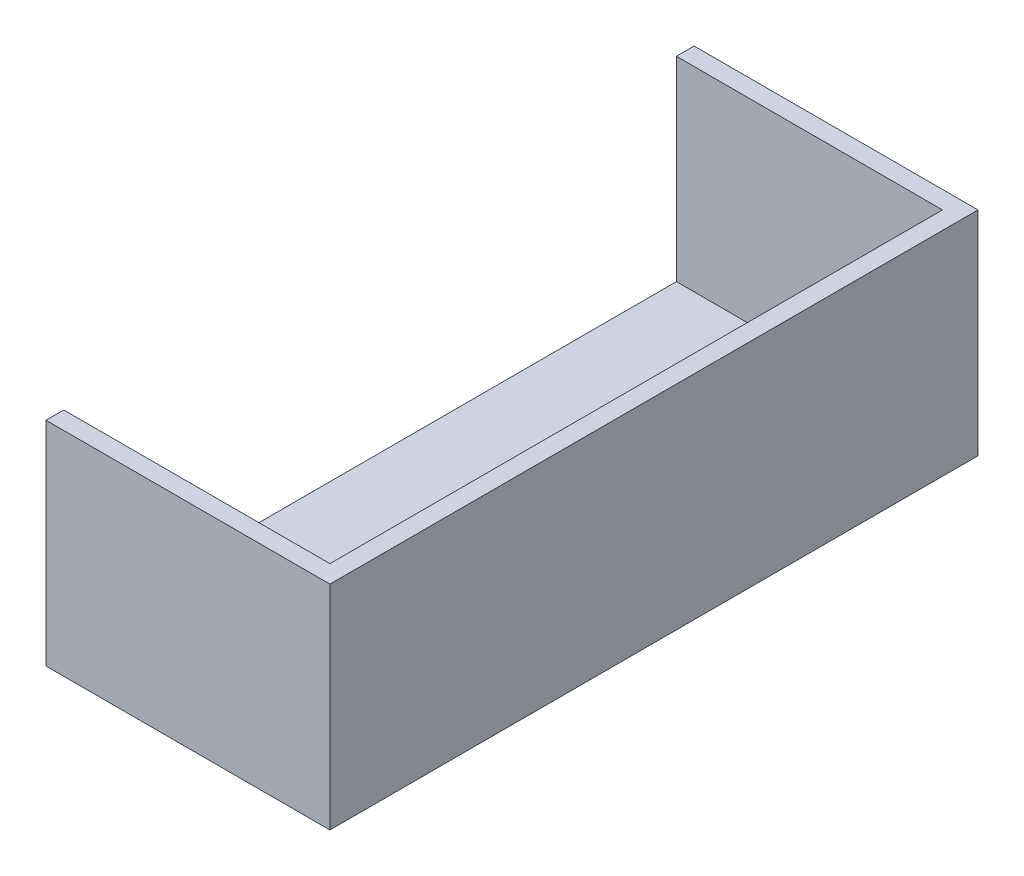
ISO-10303-21;
HEADER;
FILE_DESCRIPTION(('STEP AP214'),'2;1');
FILE_NAME('part.step','',(''),(''),'','','');
FILE_SCHEMA(('AUTOMOTIVE_DESIGN { 1 0 10303 214 1 1 1 1 }'));
ENDSEC;
DATA;
#1=APPLICATION_CONTEXT('core data for automotive mechanical design processes');
#2=APPLICATION_PROTOCOL_DEFINITION('international standard','automotive_design',2000,#1);
#3=PRODUCT_CONTEXT('',#1,'mechanical');
#4=PRODUCT('Part','Part','',(#3));
#5=PRODUCT_RELATED_PRODUCT_CATEGORY('part','',(#4));
#6=PRODUCT_DEFINITION_FORMATION('','',#4);
#7=PRODUCT_DEFINITION_CONTEXT('part definition',#1,'design');
#8=PRODUCT_DEFINITION('design','',#6,#7);
#9=PRODUCT_DEFINITION_SHAPE('','',#8);
#10=(LENGTH_UNIT() NAMED_UNIT(*) SI_UNIT(.MILLI.,.METRE.));
#11=(NAMED_UNIT(*) PLANE_ANGLE_UNIT() SI_UNIT($,.RADIAN.));
#12=(NAMED_UNIT(*) SI_UNIT($,.STERADIAN.) SOLID_ANGLE_UNIT());
#13=UNCERTAINTY_MEASURE_WITH_UNIT(LENGTH_MEASURE(1.E-05),#10,'distance_accuracy_value','');
#14=(GEOMETRIC_REPRESENTATION_CONTEXT(3) GLOBAL_UNCERTAINTY_ASSIGNED_CONTEXT((#13)) GLOBAL_UNIT_ASSIGNED_CONTEXT((#10,
#11,#12)) REPRESENTATION_CONTEXT('',''));
#15=CARTESIAN_POINT('',(0.,0.,0.));
#16=DIRECTION('',(0.,0.,1.));
#17=DIRECTION('',(1.,0.,0.));
#18=AXIS2_PLACEMENT_3D('',#15,#16,#17);
#19=CARTESIAN_POINT('',(-12.7,9.525,57.9882));
#20=DIRECTION('',(1.,0.,0.));
#21=DIRECTION('',(0.,1.,0.));
#22=AXIS2_PLACEMENT_3D('',#19,#20,#21);
#23=PLANE('',#22);
#24=DIRECTION('',(0.,1.,0.));
#25=VECTOR('',#24,1.);
#26=CARTESIAN_POINT('',(-12.7,9.525,56.4007));
#27=LINE('',#26,#25);
#28=CARTESIAN_POINT('',(-12.7,-7.9375,56.4007));
#29=VERTEX_POINT('',#28);
#30=CARTESIAN_POINT('',(-12.7,9.525,56.4007));
#31=VERTEX_POINT('',#30);
#32=EDGE_CURVE('E156',#29,#31,#27,.T.);
#33=ORIENTED_EDGE('',*,*,#32,.F.);
#34=DIRECTION('',(0.,0.,1.));
#35=VECTOR('',#34,1.);
#36=CARTESIAN_POINT('',(-12.7,-7.9375,57.9882));
#37=LINE('',#36,#35);
#38=CARTESIAN_POINT('',(-12.7,-7.9375,1.5875));
#39=VERTEX_POINT('',#38);
#40=EDGE_CURVE('E12',#39,#29,#37,.T.);
#41=ORIENTED_EDGE('',*,*,#40,.F.);
#42=DIRECTION('',(0.,-1.,0.));
#43=VECTOR('',#42,1.);
#44=CARTESIAN_POINT('',(-12.7,9.52499999999999,1.5875));
#45=LINE('',#44,#43);
#46=CARTESIAN_POINT('',(-12.7,9.525,1.5875));
#47=VERTEX_POINT('',#46);
#48=EDGE_CURVE('E133',#47,#39,#45,.T.);
#49=ORIENTED_EDGE('',*,*,#48,.F.);
#50=DIRECTION('',(0.,0.,-1.));
#51=VECTOR('',#50,1.);
#52=CARTESIAN_POINT('',(-12.7,9.525,57.9882));
#53=LINE('',#52,#51);
#54=CARTESIAN_POINT('',(-12.7,9.525,0.));
#55=VERTEX_POINT('',#54);
#56=EDGE_CURVE('E95',#47,#55,#53,.T.);
#57=ORIENTED_EDGE('',*,*,#56,.T.);
#58=DIRECTION('',(0.,-1.,0.));
#59=VECTOR('',#58,1.);
#60=CARTESIAN_POINT('',(-12.7,9.525,0.));
#61=LINE('',#60,#59);
#62=CARTESIAN_POINT('',(-12.7,-9.525,0.));
#63=VERTEX_POINT('',#62);
#64=EDGE_CURVE('E158',#55,#63,#61,.T.);
#65=ORIENTED_EDGE('',*,*,#64,.T.);
#66=DIRECTION('',(0.,0.,-1.));
#67=VECTOR('',#66,1.);
#68=CARTESIAN_POINT('',(-12.7,-9.525,57.9882));
#69=LINE('',#68,#67);
#70=CARTESIAN_POINT('',(-12.7,-9.525,57.9882));
#71=VERTEX_POINT('',#70);
#72=EDGE_CURVE('E181',#71,#63,#69,.T.);
#73=ORIENTED_EDGE('',*,*,#72,.F.);
#74=DIRECTION('',(0.,-1.,0.));
#75=VECTOR('',#74,1.);
#76=CARTESIAN_POINT('',(-12.7,9.525,57.9882));
#77=LINE('',#76,#75);
#78=CARTESIAN_POINT('',(-12.7,9.525,57.9882));
#79=VERTEX_POINT('',#78);
#80=EDGE_CURVE('E159',#79,#71,#77,.T.);
#81=ORIENTED_EDGE('',*,*,#80,.F.);
#82=EDGE_CURVE('E172',#79,#31,#53,.T.);
#83=ORIENTED_EDGE('',*,*,#82,.T.);
#84=EDGE_LOOP('',(#33,#41,#49,#57,#65,#73,#81,#83));
#85=FACE_BOUND('',#84,.T.);
#86=ADVANCED_FACE('F50',(#85),#23,.F.);
#87=CARTESIAN_POINT('',(12.7,9.525,57.9882));
#88=DIRECTION('',(0.,-1.,0.));
#89=DIRECTION('',(0.,0.,-1.));
#90=AXIS2_PLACEMENT_3D('',#87,#88,#89);
#91=PLANE('',#90);
#92=DIRECTION('',(1.,0.,0.));
#93=VECTOR('',#92,1.);
#94=CARTESIAN_POINT('',(12.7,9.525,56.4007));
#95=LINE('',#94,#93);
#96=CARTESIAN_POINT('',(11.1125,9.525,56.4007));
#97=VERTEX_POINT('',#96);
#98=EDGE_CURVE('E57',#31,#97,#95,.T.);
#99=ORIENTED_EDGE('',*,*,#98,.F.);
#100=ORIENTED_EDGE('',*,*,#82,.F.);
#101=DIRECTION('',(-1.,0.,0.));
#102=VECTOR('',#101,1.);
#103=CARTESIAN_POINT('',(12.7,9.525,57.9882));
#104=LINE('',#103,#102);
#105=CARTESIAN_POINT('',(12.7,9.525,57.9882));
#106=VERTEX_POINT('',#105);
#107=EDGE_CURVE('E73',#106,#79,#104,.T.);
#108=ORIENTED_EDGE('',*,*,#107,.F.);
#109=DIRECTION('',(0.,0.,-1.));
#110=VECTOR('',#109,1.);
#111=CARTESIAN_POINT('',(12.7,9.525,57.9882));
#112=LINE('',#111,#110);
#113=CARTESIAN_POINT('',(12.7,9.525,0.));
#114=VERTEX_POINT('',#113);
#115=EDGE_CURVE('E175',#106,#114,#112,.T.);
#116=ORIENTED_EDGE('',*,*,#115,.T.);
#117=DIRECTION('',(-1.,0.,0.));
#118=VECTOR('',#117,1.);
#119=CARTESIAN_POINT('',(12.7,9.525,0.));
#120=LINE('',#119,#118);
#121=EDGE_CURVE('E161',#114,#55,#120,.T.);
#122=ORIENTED_EDGE('',*,*,#121,.T.);
#123=ORIENTED_EDGE('',*,*,#56,.F.);
#124=DIRECTION('',(-1.,0.,0.));
#125=VECTOR('',#124,1.);
#126=CARTESIAN_POINT('',(12.7,9.525,1.5875));
#127=LINE('',#126,#125);
#128=CARTESIAN_POINT('',(11.1125,9.525,1.5875));
#129=VERTEX_POINT('',#128);
#130=EDGE_CURVE('E183',#129,#47,#127,.T.);
#131=ORIENTED_EDGE('',*,*,#130,.F.);
#132=DIRECTION('',(0.,0.,-1.));
#133=VECTOR('',#132,1.);
#134=CARTESIAN_POINT('',(11.1125,9.525,0.));
#135=LINE('',#134,#133);
#136=EDGE_CURVE('E139',#97,#129,#135,.T.);
#137=ORIENTED_EDGE('',*,*,#136,.F.);
#138=EDGE_LOOP('',(#99,#100,#108,#116,#122,#123,#131,#137));
#139=FACE_BOUND('',#138,.T.);
#140=ADVANCED_FACE('F188',(#139),#91,.F.);
#141=CARTESIAN_POINT('',(12.7,-9.525,57.9882));
#142=DIRECTION('',(0.,1.,0.));
#143=DIRECTION('',(-1.,0.,0.));
#144=AXIS2_PLACEMENT_3D('',#141,#142,#143);
#145=PLANE('',#144);
#146=CARTESIAN_POINT('',(0.,-9.525,10.0541666666667));
#147=DIRECTION('',(0.,1.,0.));
#148=DIRECTION('',(-1.,0.,0.));
#149=AXIS2_PLACEMENT_3D('',#146,#147,#148);
#150=CIRCLE('',#149,4.0767);
#151=CARTESIAN_POINT('',(-4.0767,-9.525,10.0541666666667));
#152=VERTEX_POINT('',#151);
#153=EDGE_CURVE('E144',#152,#152,#150,.T.);
#154=ORIENTED_EDGE('',*,*,#153,.T.);
#155=EDGE_LOOP('',(#154));
#156=FACE_BOUND('',#155,.T.);
#157=CARTESIAN_POINT('',(0.,-9.525,49.5215333333333));
#158=DIRECTION('',(0.,1.,0.));
#159=DIRECTION('',(-1.,0.,0.));
#160=AXIS2_PLACEMENT_3D('',#157,#158,#159);
#161=CIRCLE('',#160,4.0767);
#162=CARTESIAN_POINT('',(-4.0767,-9.525,49.5215333333333));
#163=VERTEX_POINT('',#162);
#164=EDGE_CURVE('E148',#163,#163,#161,.T.);
#165=ORIENTED_EDGE('',*,*,#164,.T.);
#166=EDGE_LOOP('',(#165));
#167=FACE_BOUND('',#166,.T.);
#168=DIRECTION('',(1.,0.,0.));
#169=VECTOR('',#168,1.);
#170=CARTESIAN_POINT('',(12.7,-9.525,0.));
#171=LINE('',#170,#169);
#172=CARTESIAN_POINT('',(12.7,-9.525,0.));
#173=VERTEX_POINT('',#172);
#174=EDGE_CURVE('E167',#63,#173,#171,.T.);
#175=ORIENTED_EDGE('',*,*,#174,.T.);
#176=DIRECTION('',(0.,0.,-1.));
#177=VECTOR('',#176,1.);
#178=CARTESIAN_POINT('',(12.7,-9.525,57.9882));
#179=LINE('',#178,#177);
#180=CARTESIAN_POINT('',(12.7,-9.525,57.9882));
#181=VERTEX_POINT('',#180);
#182=EDGE_CURVE('E178',#181,#173,#179,.T.);
#183=ORIENTED_EDGE('',*,*,#182,.F.);
#184=DIRECTION('',(1.,0.,0.));
#185=VECTOR('',#184,1.);
#186=CARTESIAN_POINT('',(12.7,-9.525,57.9882));
#187=LINE('',#186,#185);
#188=EDGE_CURVE('E103',#71,#181,#187,.T.);
#189=ORIENTED_EDGE('',*,*,#188,.F.);
#190=ORIENTED_EDGE('',*,*,#72,.T.);
#191=EDGE_LOOP('',(#175,#183,#189,#190));
#192=FACE_BOUND('',#191,.T.);
#193=ADVANCED_FACE('F197',(#156,#167,#192),#145,.F.);
#194=CARTESIAN_POINT('',(12.7,9.525,57.9882));
#195=DIRECTION('',(-1.,0.,0.));
#196=DIRECTION('',(0.,-1.,0.));
#197=AXIS2_PLACEMENT_3D('',#194,#195,#196);
#198=PLANE('',#197);
#199=DIRECTION('',(0.,1.,0.));
#200=VECTOR('',#199,1.);
#201=CARTESIAN_POINT('',(12.7,9.525,0.));
#202=LINE('',#201,#200);
#203=EDGE_CURVE('E169',#173,#114,#202,.T.);
#204=ORIENTED_EDGE('',*,*,#203,.T.);
#205=ORIENTED_EDGE('',*,*,#115,.F.);
#206=DIRECTION('',(0.,1.,0.));
#207=VECTOR('',#206,1.);
#208=CARTESIAN_POINT('',(12.7,9.525,57.9882));
#209=LINE('',#208,#207);
#210=EDGE_CURVE('E163',#181,#106,#209,.T.);
#211=ORIENTED_EDGE('',*,*,#210,.F.);
#212=ORIENTED_EDGE('',*,*,#182,.T.);
#213=EDGE_LOOP('',(#204,#205,#211,#212));
#214=FACE_BOUND('',#213,.T.);
#215=ADVANCED_FACE('F200',(#214),#198,.F.);
#216=CARTESIAN_POINT('',(0.,0.,57.9882));
#217=DIRECTION('',(0.,0.,-1.));
#218=DIRECTION('',(-1.,0.,0.));
#219=AXIS2_PLACEMENT_3D('',#216,#217,#218);
#220=PLANE('',#219);
#221=ORIENTED_EDGE('',*,*,#80,.T.);
#222=ORIENTED_EDGE('',*,*,#188,.T.);
#223=ORIENTED_EDGE('',*,*,#210,.T.);
#224=ORIENTED_EDGE('',*,*,#107,.T.);
#225=EDGE_LOOP('',(#221,#222,#223,#224));
#226=FACE_BOUND('',#225,.T.);
#227=ADVANCED_FACE('F201',(#226),#220,.F.);
#228=CARTESIAN_POINT('',(0.,0.,0.));
#229=DIRECTION('',(0.,0.,-1.));
#230=DIRECTION('',(-1.,0.,0.));
#231=AXIS2_PLACEMENT_3D('',#228,#229,#230);
#232=PLANE('',#231);
#233=ORIENTED_EDGE('',*,*,#64,.F.);
#234=ORIENTED_EDGE('',*,*,#121,.F.);
#235=ORIENTED_EDGE('',*,*,#203,.F.);
#236=ORIENTED_EDGE('',*,*,#174,.F.);
#237=EDGE_LOOP('',(#233,#234,#235,#236));
#238=FACE_BOUND('',#237,.T.);
#239=ADVANCED_FACE('F194',(#238),#232,.T.);
#240=CARTESIAN_POINT('',(-12.700012,-7.9375,0.));
#241=DIRECTION('',(0.,1.,0.));
#242=DIRECTION('',(-1.,0.,0.));
#243=AXIS2_PLACEMENT_3D('',#240,#241,#242);
#244=PLANE('',#243);
#245=CARTESIAN_POINT('',(0.,-7.9375,10.0541666666667));
#246=DIRECTION('',(0.,1.,0.));
#247=DIRECTION('',(-1.,0.,0.));
#248=AXIS2_PLACEMENT_3D('',#245,#246,#247);
#249=CIRCLE('',#248,4.0767);
#250=CARTESIAN_POINT('',(-4.0767,-7.9375,10.0541666666667));
#251=VERTEX_POINT('',#250);
#252=EDGE_CURVE('E228',#251,#251,#249,.T.);
#253=ORIENTED_EDGE('',*,*,#252,.F.);
#254=EDGE_LOOP('',(#253));
#255=FACE_BOUND('',#254,.T.);
#256=CARTESIAN_POINT('',(0.,-7.9375,49.5215333333333));
#257=DIRECTION('',(0.,1.,0.));
#258=DIRECTION('',(-1.,0.,0.));
#259=AXIS2_PLACEMENT_3D('',#256,#257,#258);
#260=CIRCLE('',#259,4.0767);
#261=CARTESIAN_POINT('',(-4.0767,-7.9375,49.5215333333333));
#262=VERTEX_POINT('',#261);
#263=EDGE_CURVE('E232',#262,#262,#260,.T.);
#264=ORIENTED_EDGE('',*,*,#263,.F.);
#265=EDGE_LOOP('',(#264));
#266=FACE_BOUND('',#265,.T.);
#267=ORIENTED_EDGE('',*,*,#40,.T.);
#268=DIRECTION('',(1.,0.,0.));
#269=VECTOR('',#268,1.);
#270=CARTESIAN_POINT('',(-12.700012,-7.9375,56.4007));
#271=LINE('',#270,#269);
#272=CARTESIAN_POINT('',(11.1125,-7.9375,56.4007));
#273=VERTEX_POINT('',#272);
#274=EDGE_CURVE('E125',#29,#273,#271,.T.);
#275=ORIENTED_EDGE('',*,*,#274,.T.);
#276=DIRECTION('',(0.,0.,1.));
#277=VECTOR('',#276,1.);
#278=CARTESIAN_POINT('',(11.1125,-7.9375,0.));
#279=LINE('',#278,#277);
#280=CARTESIAN_POINT('',(11.1125,-7.9375,1.5875));
#281=VERTEX_POINT('',#280);
#282=EDGE_CURVE('E128',#281,#273,#279,.T.);
#283=ORIENTED_EDGE('',*,*,#282,.F.);
#284=DIRECTION('',(1.,0.,0.));
#285=VECTOR('',#284,1.);
#286=CARTESIAN_POINT('',(-12.700012,-7.9375,1.5875));
#287=LINE('',#286,#285);
#288=EDGE_CURVE('E134',#39,#281,#287,.T.);
#289=ORIENTED_EDGE('',*,*,#288,.F.);
#290=EDGE_LOOP('',(#267,#275,#283,#289));
#291=FACE_BOUND('',#290,.T.);
#292=ADVANCED_FACE('F126',(#255,#266,#291),#244,.T.);
#293=CARTESIAN_POINT('',(-12.700012,0.,56.4007));
#294=DIRECTION('',(0.,0.,-1.));
#295=DIRECTION('',(-1.,0.,0.));
#296=AXIS2_PLACEMENT_3D('',#293,#294,#295);
#297=PLANE('',#296);
#298=ORIENTED_EDGE('',*,*,#32,.T.);
#299=ORIENTED_EDGE('',*,*,#98,.T.);
#300=DIRECTION('',(0.,1.,0.));
#301=VECTOR('',#300,1.);
#302=CARTESIAN_POINT('',(11.1125,0.,56.4007));
#303=LINE('',#302,#301);
#304=EDGE_CURVE('E64',#273,#97,#303,.T.);
#305=ORIENTED_EDGE('',*,*,#304,.F.);
#306=ORIENTED_EDGE('',*,*,#274,.F.);
#307=EDGE_LOOP('',(#298,#299,#305,#306));
#308=FACE_BOUND('',#307,.T.);
#309=ADVANCED_FACE('F136',(#308),#297,.T.);
#310=CARTESIAN_POINT('',(-12.700012,0.,1.5875));
#311=DIRECTION('',(0.,0.,1.));
#312=DIRECTION('',(0.,-1.,0.));
#313=AXIS2_PLACEMENT_3D('',#310,#311,#312);
#314=PLANE('',#313);
#315=ORIENTED_EDGE('',*,*,#48,.T.);
#316=ORIENTED_EDGE('',*,*,#288,.T.);
#317=DIRECTION('',(0.,-1.,0.));
#318=VECTOR('',#317,1.);
#319=CARTESIAN_POINT('',(11.1125,0.,1.5875));
#320=LINE('',#319,#318);
#321=EDGE_CURVE('E143',#129,#281,#320,.T.);
#322=ORIENTED_EDGE('',*,*,#321,.F.);
#323=ORIENTED_EDGE('',*,*,#130,.T.);
#324=EDGE_LOOP('',(#315,#316,#322,#323));
#325=FACE_BOUND('',#324,.T.);
#326=ADVANCED_FACE('F186',(#325),#314,.T.);
#327=CARTESIAN_POINT('',(11.1125,0.,0.));
#328=DIRECTION('',(-1.,0.,0.));
#329=DIRECTION('',(0.,-1.,0.));
#330=AXIS2_PLACEMENT_3D('',#327,#328,#329);
#331=PLANE('',#330);
#332=ORIENTED_EDGE('',*,*,#282,.T.);
#333=ORIENTED_EDGE('',*,*,#304,.T.);
#334=ORIENTED_EDGE('',*,*,#136,.T.);
#335=ORIENTED_EDGE('',*,*,#321,.T.);
#336=EDGE_LOOP('',(#332,#333,#334,#335));
#337=FACE_BOUND('',#336,.T.);
#338=ADVANCED_FACE('F141',(#337),#331,.T.);
#339=CARTESIAN_POINT('',(0.,-31.75,49.5215333333333));
#340=DIRECTION('',(0.,1.,0.));
#341=DIRECTION('',(-1.,0.,0.));
#342=AXIS2_PLACEMENT_3D('',#339,#340,#341);
#343=CYLINDRICAL_SURFACE('',#342,4.0767);
#344=ORIENTED_EDGE('',*,*,#263,.T.);
#345=EDGE_LOOP('',(#344));
#346=FACE_BOUND('',#345,.T.);
#347=ORIENTED_EDGE('',*,*,#164,.F.);
#348=EDGE_LOOP('',(#347));
#349=FACE_BOUND('',#348,.T.);
#350=ADVANCED_FACE('F243',(#346,#349),#343,.F.);
#351=CARTESIAN_POINT('',(0.,-31.75,10.0541666666667));
#352=DIRECTION('',(0.,1.,0.));
#353=DIRECTION('',(-1.,0.,0.));
#354=AXIS2_PLACEMENT_3D('',#351,#352,#353);
#355=CYLINDRICAL_SURFACE('',#354,4.0767);
#356=ORIENTED_EDGE('',*,*,#252,.T.);
#357=EDGE_LOOP('',(#356));
#358=FACE_BOUND('',#357,.T.);
#359=ORIENTED_EDGE('',*,*,#153,.F.);
#360=EDGE_LOOP('',(#359));
#361=FACE_BOUND('',#360,.T.);
#362=ADVANCED_FACE('F259',(#358,#361),#355,.F.);
#363=CLOSED_SHELL('',(#86,#140,#193,#215,#227,#239,#292,#309,#326,#338,#350,#362));
#364=MANIFOLD_SOLID_BREP('B2',#363);
#365=ADVANCED_BREP_SHAPE_REPRESENTATION('',(#18,#364),#14);
#366=SHAPE_DEFINITION_REPRESENTATION(#9,#365);
ENDSEC;
END-ISO-10303-21;
